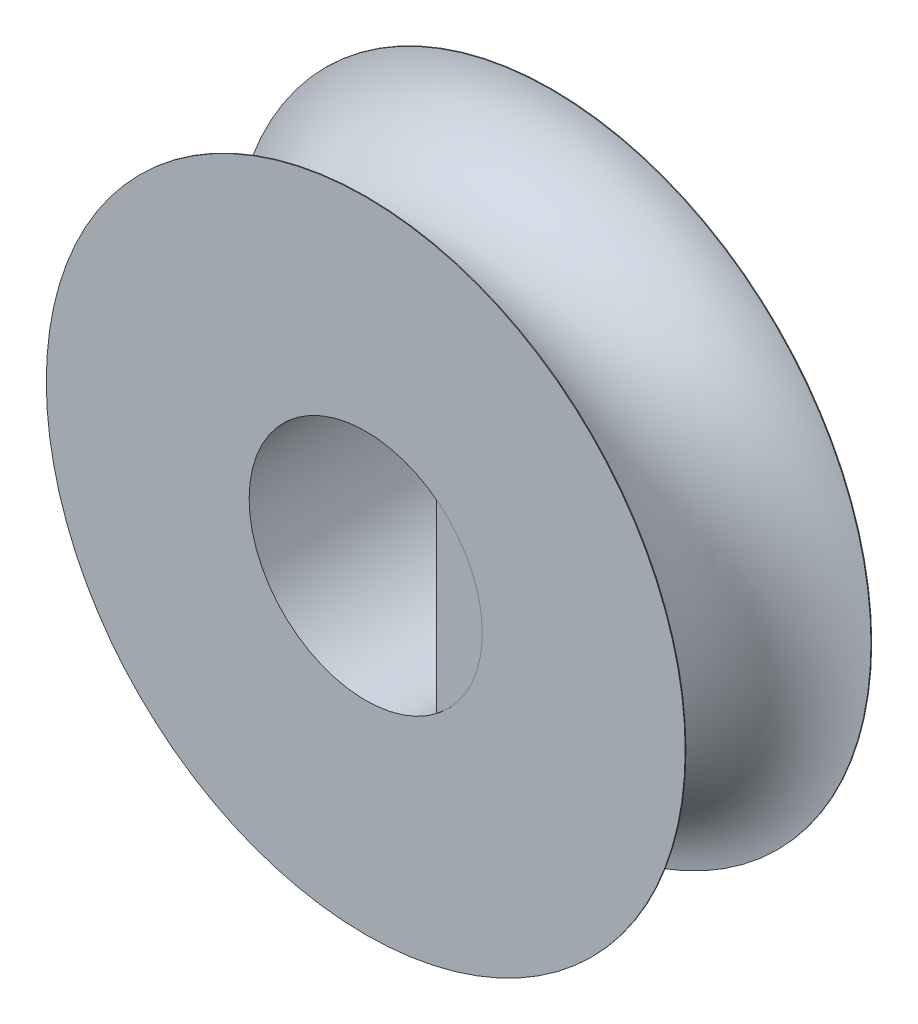
ISO-10303-21;
HEADER;
FILE_DESCRIPTION(('STEP AP214'),'2;1');
FILE_NAME('part.step','',(''),(''),'','','');
FILE_SCHEMA(('AUTOMOTIVE_DESIGN { 1 0 10303 214 1 1 1 1 }'));
ENDSEC;
DATA;
#1=APPLICATION_CONTEXT('core data for automotive mechanical design processes');
#2=APPLICATION_PROTOCOL_DEFINITION('international standard','automotive_design',2000,#1);
#3=PRODUCT_CONTEXT('',#1,'mechanical');
#4=PRODUCT('Part','Part','',(#3));
#5=PRODUCT_RELATED_PRODUCT_CATEGORY('part','',(#4));
#6=PRODUCT_DEFINITION_FORMATION('','',#4);
#7=PRODUCT_DEFINITION_CONTEXT('part definition',#1,'design');
#8=PRODUCT_DEFINITION('design','',#6,#7);
#9=PRODUCT_DEFINITION_SHAPE('','',#8);
#10=(LENGTH_UNIT() NAMED_UNIT(*) SI_UNIT(.MILLI.,.METRE.));
#11=(NAMED_UNIT(*) PLANE_ANGLE_UNIT() SI_UNIT($,.RADIAN.));
#12=(NAMED_UNIT(*) SI_UNIT($,.STERADIAN.) SOLID_ANGLE_UNIT());
#13=UNCERTAINTY_MEASURE_WITH_UNIT(LENGTH_MEASURE(1.E-05),#10,'distance_accuracy_value','');
#14=(GEOMETRIC_REPRESENTATION_CONTEXT(3) GLOBAL_UNCERTAINTY_ASSIGNED_CONTEXT((#13)) GLOBAL_UNIT_ASSIGNED_CONTEXT((#10,
#11,#12)) REPRESENTATION_CONTEXT('',''));
#15=CARTESIAN_POINT('',(0.,0.,0.));
#16=DIRECTION('',(0.,0.,1.));
#17=DIRECTION('',(1.,0.,0.));
#18=AXIS2_PLACEMENT_3D('',#15,#16,#17);
#19=CARTESIAN_POINT('',(0.,0.,8.));
#20=DIRECTION('',(0.,0.,-1.));
#21=DIRECTION('',(-1.,0.,0.));
#22=AXIS2_PLACEMENT_3D('',#19,#20,#21);
#23=CYLINDRICAL_SURFACE('',#22,5.);
#24=CARTESIAN_POINT('',(0.,0.,8.));
#25=DIRECTION('',(0.,0.,-1.));
#26=DIRECTION('',(-1.,0.,0.));
#27=AXIS2_PLACEMENT_3D('',#24,#25,#26);
#28=CIRCLE('',#27,5.);
#29=CARTESIAN_POINT('',(-5.,0.,8.));
#30=VERTEX_POINT('',#29);
#31=EDGE_CURVE('E97',#30,#30,#28,.T.);
#32=ORIENTED_EDGE('',*,*,#31,.F.);
#33=EDGE_LOOP('',(#32));
#34=FACE_BOUND('',#33,.T.);
#35=DIRECTION('',(0.,0.,-1.));
#36=VECTOR('',#35,1.);
#37=CARTESIAN_POINT('',(3.,-4.,8.));
#38=LINE('',#37,#36);
#39=CARTESIAN_POINT('',(3.,-4.,7.96862696659689));
#40=VERTEX_POINT('',#39);
#41=CARTESIAN_POINT('',(3.,-4.,0.));
#42=VERTEX_POINT('',#41);
#43=EDGE_CURVE('E68',#40,#42,#38,.T.);
#44=ORIENTED_EDGE('',*,*,#43,.T.);
#45=CARTESIAN_POINT('',(0.,0.,0.));
#46=DIRECTION('',(0.,0.,-1.));
#47=DIRECTION('',(-1.,0.,0.));
#48=AXIS2_PLACEMENT_3D('',#45,#46,#47);
#49=CIRCLE('',#48,5.);
#50=CARTESIAN_POINT('',(3.,4.,0.));
#51=VERTEX_POINT('',#50);
#52=EDGE_CURVE('E75',#42,#51,#49,.T.);
#53=ORIENTED_EDGE('',*,*,#52,.T.);
#54=DIRECTION('',(0.,0.,-1.));
#55=VECTOR('',#54,1.);
#56=CARTESIAN_POINT('',(3.,4.,8.));
#57=LINE('',#56,#55);
#58=CARTESIAN_POINT('',(3.,4.,7.96862696659689));
#59=VERTEX_POINT('',#58);
#60=EDGE_CURVE('E74',#51,#59,#57,.F.);
#61=ORIENTED_EDGE('',*,*,#60,.T.);
#62=CARTESIAN_POINT('',(0.,0.,7.96862696659689));
#63=DIRECTION('',(0.,0.,-1.));
#64=DIRECTION('',(-1.,0.,0.));
#65=AXIS2_PLACEMENT_3D('',#62,#63,#64);
#66=CIRCLE('',#65,5.);
#67=EDGE_CURVE('E64',#59,#40,#66,.T.);
#68=ORIENTED_EDGE('',*,*,#67,.T.);
#69=EDGE_LOOP('',(#44,#53,#61,#68));
#70=FACE_BOUND('',#69,.T.);
#71=ADVANCED_FACE('F46',(#34,#70),#23,.F.);
#72=CARTESIAN_POINT('',(0.,0.,8.));
#73=DIRECTION('',(0.,0.,-1.));
#74=DIRECTION('',(-1.,0.,0.));
#75=AXIS2_PLACEMENT_3D('',#72,#73,#74);
#76=CYLINDRICAL_SURFACE('',#75,13.7);
#77=CARTESIAN_POINT('',(0.,0.,8.));
#78=DIRECTION('',(0.,0.,1.));
#79=DIRECTION('',(1.,0.,0.));
#80=AXIS2_PLACEMENT_3D('',#77,#78,#79);
#81=CIRCLE('',#80,13.7);
#82=CARTESIAN_POINT('',(13.7,0.,8.));
#83=VERTEX_POINT('',#82);
#84=EDGE_CURVE('E11',#83,#83,#81,.T.);
#85=ORIENTED_EDGE('',*,*,#84,.F.);
#86=EDGE_LOOP('',(#85));
#87=FACE_BOUND('',#86,.T.);
#88=CARTESIAN_POINT('',(0.,0.,7.96862696659689));
#89=DIRECTION('',(0.,0.,-1.));
#90=DIRECTION('',(-1.,0.,0.));
#91=AXIS2_PLACEMENT_3D('',#88,#89,#90);
#92=CIRCLE('',#91,13.7);
#93=CARTESIAN_POINT('',(-13.7,0.,7.96862696659689));
#94=VERTEX_POINT('',#93);
#95=EDGE_CURVE('E50',#94,#94,#92,.T.);
#96=ORIENTED_EDGE('',*,*,#95,.F.);
#97=EDGE_LOOP('',(#96));
#98=FACE_BOUND('',#97,.T.);
#99=ADVANCED_FACE('F48',(#87,#98),#76,.T.);
#100=CARTESIAN_POINT('',(0.,0.,8.));
#101=DIRECTION('',(0.,0.,1.));
#102=DIRECTION('',(1.,0.,0.));
#103=AXIS2_PLACEMENT_3D('',#100,#101,#102);
#104=PLANE('',#103);
#105=ORIENTED_EDGE('',*,*,#31,.T.);
#106=EDGE_LOOP('',(#105));
#107=FACE_BOUND('',#106,.T.);
#108=ORIENTED_EDGE('',*,*,#84,.T.);
#109=EDGE_LOOP('',(#108));
#110=FACE_BOUND('',#109,.T.);
#111=ADVANCED_FACE('F117',(#107,#110),#104,.T.);
#112=CARTESIAN_POINT('',(0.,0.,4.));
#113=DIRECTION('',(0.,0.,1.));
#114=DIRECTION('',(1.,0.,0.));
#115=AXIS2_PLACEMENT_3D('',#112,#113,#114);
#116=TOROIDAL_SURFACE('',#115,14.2,4.);
#117=CARTESIAN_POINT('',(0.,0.,0.0313730334031139));
#118=DIRECTION('',(0.,0.,1.));
#119=DIRECTION('',(1.,0.,0.));
#120=AXIS2_PLACEMENT_3D('',#117,#118,#119);
#121=CIRCLE('',#120,13.7);
#122=CARTESIAN_POINT('',(13.7,0.,0.0313730334031139));
#123=VERTEX_POINT('',#122);
#124=EDGE_CURVE('E101',#123,#123,#121,.T.);
#125=ORIENTED_EDGE('',*,*,#124,.T.);
#126=EDGE_LOOP('',(#125));
#127=FACE_BOUND('',#126,.T.);
#128=ORIENTED_EDGE('',*,*,#95,.T.);
#129=EDGE_LOOP('',(#128));
#130=FACE_BOUND('',#129,.T.);
#131=ADVANCED_FACE('F114',(#127,#130),#116,.F.);
#132=CARTESIAN_POINT('',(0.,0.,0.));
#133=DIRECTION('',(0.,0.,1.));
#134=DIRECTION('',(1.,0.,0.));
#135=AXIS2_PLACEMENT_3D('',#132,#133,#134);
#136=PLANE('',#135);
#137=ORIENTED_EDGE('',*,*,#52,.F.);
#138=DIRECTION('',(0.,1.,0.));
#139=VECTOR('',#138,1.);
#140=CARTESIAN_POINT('',(3.,6.69863382369985,0.));
#141=LINE('',#140,#139);
#142=EDGE_CURVE('E90',#42,#51,#141,.T.);
#143=ORIENTED_EDGE('',*,*,#142,.T.);
#144=EDGE_LOOP('',(#137,#143));
#145=FACE_BOUND('',#144,.T.);
#146=CARTESIAN_POINT('',(0.,0.,0.));
#147=DIRECTION('',(0.,0.,1.));
#148=DIRECTION('',(1.,0.,0.));
#149=AXIS2_PLACEMENT_3D('',#146,#147,#148);
#150=CIRCLE('',#149,13.7);
#151=CARTESIAN_POINT('',(13.7,0.,0.));
#152=VERTEX_POINT('',#151);
#153=EDGE_CURVE('E56',#152,#152,#150,.T.);
#154=ORIENTED_EDGE('',*,*,#153,.F.);
#155=EDGE_LOOP('',(#154));
#156=FACE_BOUND('',#155,.T.);
#157=ADVANCED_FACE('F130',(#145,#156),#136,.F.);
#158=ORIENTED_EDGE('',*,*,#153,.T.);
#159=EDGE_LOOP('',(#158));
#160=FACE_BOUND('',#159,.T.);
#161=ORIENTED_EDGE('',*,*,#124,.F.);
#162=EDGE_LOOP('',(#161));
#163=FACE_BOUND('',#162,.T.);
#164=ADVANCED_FACE('F119',(#160,#163),#76,.T.);
#165=CARTESIAN_POINT('',(3.,0.,0.));
#166=DIRECTION('',(1.,0.,0.));
#167=DIRECTION('',(0.,0.,-1.));
#168=AXIS2_PLACEMENT_3D('',#165,#166,#167);
#169=PLANE('',#168);
#170=ORIENTED_EDGE('',*,*,#43,.F.);
#171=DIRECTION('',(0.,-1.,0.));
#172=VECTOR('',#171,1.);
#173=CARTESIAN_POINT('',(3.,6.69863382369985,7.96862696659689));
#174=LINE('',#173,#172);
#175=EDGE_CURVE('E85',#59,#40,#174,.T.);
#176=ORIENTED_EDGE('',*,*,#175,.F.);
#177=ORIENTED_EDGE('',*,*,#60,.F.);
#178=ORIENTED_EDGE('',*,*,#142,.F.);
#179=EDGE_LOOP('',(#170,#176,#177,#178));
#180=FACE_BOUND('',#179,.T.);
#181=ADVANCED_FACE('F88',(#180),#169,.F.);
#182=CARTESIAN_POINT('',(13.8337763885356,6.69863382369985,7.96862696659689));
#183=DIRECTION('',(0.,0.,-1.));
#184=DIRECTION('',(-1.,0.,0.));
#185=AXIS2_PLACEMENT_3D('',#182,#183,#184);
#186=PLANE('',#185);
#187=ORIENTED_EDGE('',*,*,#67,.F.);
#188=ORIENTED_EDGE('',*,*,#175,.T.);
#189=EDGE_LOOP('',(#187,#188));
#190=FACE_BOUND('',#189,.T.);
#191=ADVANCED_FACE('F84',(#190),#186,.F.);
#192=CLOSED_SHELL('',(#71,#99,#111,#131,#157,#164,#181,#191));
#193=MANIFOLD_SOLID_BREP('B2',#192);
#194=ADVANCED_BREP_SHAPE_REPRESENTATION('',(#18,#193),#14);
#195=SHAPE_DEFINITION_REPRESENTATION(#9,#194);
ENDSEC;
END-ISO-10303-21;
